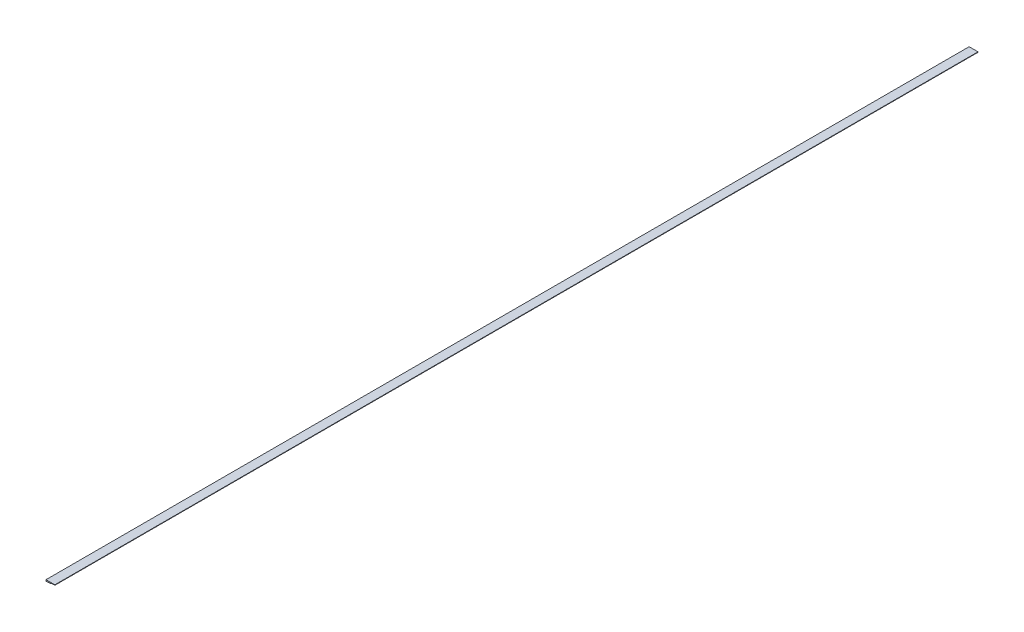
ISO-10303-21;
HEADER;
FILE_DESCRIPTION(('STEP AP214'),'2;1');
FILE_NAME('part.step','',(''),(''),'','','');
FILE_SCHEMA(('AUTOMOTIVE_DESIGN { 1 0 10303 214 1 1 1 1 }'));
ENDSEC;
DATA;
#1=APPLICATION_CONTEXT('core data for automotive mechanical design processes');
#2=APPLICATION_PROTOCOL_DEFINITION('international standard','automotive_design',2000,#1);
#3=PRODUCT_CONTEXT('',#1,'mechanical');
#4=PRODUCT('Part','Part','',(#3));
#5=PRODUCT_RELATED_PRODUCT_CATEGORY('part','',(#4));
#6=PRODUCT_DEFINITION_FORMATION('','',#4);
#7=PRODUCT_DEFINITION_CONTEXT('part definition',#1,'design');
#8=PRODUCT_DEFINITION('design','',#6,#7);
#9=PRODUCT_DEFINITION_SHAPE('','',#8);
#10=(LENGTH_UNIT() NAMED_UNIT(*) SI_UNIT(.MILLI.,.METRE.));
#11=(NAMED_UNIT(*) PLANE_ANGLE_UNIT() SI_UNIT($,.RADIAN.));
#12=(NAMED_UNIT(*) SI_UNIT($,.STERADIAN.) SOLID_ANGLE_UNIT());
#13=UNCERTAINTY_MEASURE_WITH_UNIT(LENGTH_MEASURE(1.E-05),#10,'distance_accuracy_value','');
#14=(GEOMETRIC_REPRESENTATION_CONTEXT(3) GLOBAL_UNCERTAINTY_ASSIGNED_CONTEXT((#13)) GLOBAL_UNIT_ASSIGNED_CONTEXT((#10,
#11,#12)) REPRESENTATION_CONTEXT('',''));
#15=CARTESIAN_POINT('',(0.,0.,0.));
#16=DIRECTION('',(0.,0.,1.));
#17=DIRECTION('',(1.,0.,0.));
#18=AXIS2_PLACEMENT_3D('',#15,#16,#17);
#19=CARTESIAN_POINT('',(-7.61942410709883,25.399999999932,-5265.01611975517));
#20=DIRECTION('',(0.,-1.,0.));
#21=DIRECTION('',(1.,0.,0.));
#22=AXIS2_PLACEMENT_3D('',#19,#20,#21);
#23=PLANE('',#22);
#24=DIRECTION('',(-1.,0.,0.));
#25=VECTOR('',#24,1.);
#26=CARTESIAN_POINT('',(-7.61942410709883,25.399999999932,-5214.4));
#27=LINE('',#26,#25);
#28=CARTESIAN_POINT('',(-4.44442410709883,25.399999999932,-5214.4));
#29=VERTEX_POINT('',#28);
#30=CARTESIAN_POINT('',(-7.61942410709883,25.399999999932,-5214.4));
#31=VERTEX_POINT('',#30);
#32=EDGE_CURVE('E43',#29,#31,#27,.T.);
#33=ORIENTED_EDGE('',*,*,#32,.F.);
#34=DIRECTION('',(0.,0.,1.));
#35=VECTOR('',#34,1.);
#36=CARTESIAN_POINT('',(-4.44442410709883,25.399999999932,-5265.01611975517));
#37=LINE('',#36,#35);
#38=CARTESIAN_POINT('',(-4.44442410709883,25.399999999932,0.));
#39=VERTEX_POINT('',#38);
#40=EDGE_CURVE('E88',#29,#39,#37,.T.);
#41=ORIENTED_EDGE('',*,*,#40,.T.);
#42=DIRECTION('',(1.,0.,0.));
#43=VECTOR('',#42,1.);
#44=CARTESIAN_POINT('',(-7.61942410709883,25.399999999932,0.));
#45=LINE('',#44,#43);
#46=CARTESIAN_POINT('',(-7.61942410709883,25.399999999932,0.));
#47=VERTEX_POINT('',#46);
#48=EDGE_CURVE('E92',#47,#39,#45,.T.);
#49=ORIENTED_EDGE('',*,*,#48,.F.);
#50=DIRECTION('',(0.,0.,1.));
#51=VECTOR('',#50,1.);
#52=CARTESIAN_POINT('',(-7.61942410709883,25.399999999932,-5265.01611975517));
#53=LINE('',#52,#51);
#54=EDGE_CURVE('E125',#31,#47,#53,.T.);
#55=ORIENTED_EDGE('',*,*,#54,.F.);
#56=EDGE_LOOP('',(#33,#41,#49,#55));
#57=FACE_BOUND('',#56,.T.);
#58=ADVANCED_FACE('F35',(#57),#23,.T.);
#59=CARTESIAN_POINT('',(-7.61942410709883,25.399999999932,-5265.01611975517));
#60=DIRECTION('',(0.0871557427456795,-0.996194698091919,0.));
#61=DIRECTION('',(0.996194698091919,0.0871557427456795,0.));
#62=AXIS2_PLACEMENT_3D('',#59,#60,#61);
#63=PLANE('',#62);
#64=DIRECTION('',(-0.996194698091919,-0.0871557427456795,0.));
#65=VECTOR('',#64,1.);
#66=CARTESIAN_POINT('',(-7.61942410709885,25.399999999932,-5214.4));
#67=LINE('',#66,#65);
#68=CARTESIAN_POINT('',(-32.6194241070988,23.2127834118339,-5214.4));
#69=VERTEX_POINT('',#68);
#70=EDGE_CURVE('E158',#31,#69,#67,.T.);
#71=ORIENTED_EDGE('',*,*,#70,.F.);
#72=ORIENTED_EDGE('',*,*,#54,.T.);
#73=DIRECTION('',(0.996194698091919,0.0871557427456795,0.));
#74=VECTOR('',#73,1.);
#75=CARTESIAN_POINT('',(-7.61942410709883,25.399999999932,0.));
#76=LINE('',#75,#74);
#77=CARTESIAN_POINT('',(-32.6194241070988,23.2127834118339,0.));
#78=VERTEX_POINT('',#77);
#79=EDGE_CURVE('E98',#78,#47,#76,.T.);
#80=ORIENTED_EDGE('',*,*,#79,.F.);
#81=DIRECTION('',(0.,0.,1.));
#82=VECTOR('',#81,1.);
#83=CARTESIAN_POINT('',(-32.6194241070988,23.2127834118339,-5265.01611975517));
#84=LINE('',#83,#82);
#85=EDGE_CURVE('E128',#69,#78,#84,.T.);
#86=ORIENTED_EDGE('',*,*,#85,.F.);
#87=EDGE_LOOP('',(#71,#72,#80,#86));
#88=FACE_BOUND('',#87,.T.);
#89=ADVANCED_FACE('F157',(#88),#63,.T.);
#90=CARTESIAN_POINT('',(-32.6194241070988,31.0862565380551,-5265.01611975517));
#91=DIRECTION('',(-1.,0.,0.));
#92=DIRECTION('',(0.,-1.,0.));
#93=AXIS2_PLACEMENT_3D('',#90,#91,#92);
#94=PLANE('',#93);
#95=DIRECTION('',(0.,1.,0.));
#96=VECTOR('',#95,1.);
#97=CARTESIAN_POINT('',(-32.6194241070988,31.0862565380549,-5214.4));
#98=LINE('',#97,#96);
#99=CARTESIAN_POINT('',(-32.6194241070989,31.0862565380551,-5214.4));
#100=VERTEX_POINT('',#99);
#101=EDGE_CURVE('E154',#69,#100,#98,.T.);
#102=ORIENTED_EDGE('',*,*,#101,.F.);
#103=ORIENTED_EDGE('',*,*,#85,.T.);
#104=DIRECTION('',(0.,-1.,0.));
#105=VECTOR('',#104,1.);
#106=CARTESIAN_POINT('',(-32.6194241070988,31.0862565380551,0.));
#107=LINE('',#106,#105);
#108=CARTESIAN_POINT('',(-32.6194241070988,31.0862565380551,0.));
#109=VERTEX_POINT('',#108);
#110=EDGE_CURVE('E122',#109,#78,#107,.T.);
#111=ORIENTED_EDGE('',*,*,#110,.F.);
#112=DIRECTION('',(0.,0.,1.));
#113=VECTOR('',#112,1.);
#114=CARTESIAN_POINT('',(-32.6194241070988,31.0862565380551,-5265.01611975517));
#115=LINE('',#114,#113);
#116=EDGE_CURVE('E130',#100,#109,#115,.T.);
#117=ORIENTED_EDGE('',*,*,#116,.F.);
#118=EDGE_LOOP('',(#102,#103,#111,#117));
#119=FACE_BOUND('',#118,.T.);
#120=ADVANCED_FACE('F152',(#119),#94,.T.);
#121=CARTESIAN_POINT('',(17.3805758929012,31.0862565380551,-5265.01611975517));
#122=DIRECTION('',(0.,1.,0.));
#123=DIRECTION('',(-1.,0.,0.));
#124=AXIS2_PLACEMENT_3D('',#121,#122,#123);
#125=PLANE('',#124);
#126=DIRECTION('',(1.,0.,0.));
#127=VECTOR('',#126,1.);
#128=CARTESIAN_POINT('',(17.3805758929012,31.0862565380551,-5214.4));
#129=LINE('',#128,#127);
#130=CARTESIAN_POINT('',(17.3805758929012,31.0862565380551,-5214.4));
#131=VERTEX_POINT('',#130);
#132=EDGE_CURVE('E149',#100,#131,#129,.T.);
#133=ORIENTED_EDGE('',*,*,#132,.F.);
#134=ORIENTED_EDGE('',*,*,#116,.T.);
#135=DIRECTION('',(-1.,0.,0.));
#136=VECTOR('',#135,1.);
#137=CARTESIAN_POINT('',(17.3805758929012,31.0862565380551,0.));
#138=LINE('',#137,#136);
#139=CARTESIAN_POINT('',(17.3805758929012,31.0862565380551,0.));
#140=VERTEX_POINT('',#139);
#141=EDGE_CURVE('E119',#140,#109,#138,.T.);
#142=ORIENTED_EDGE('',*,*,#141,.F.);
#143=DIRECTION('',(0.,0.,1.));
#144=VECTOR('',#143,1.);
#145=CARTESIAN_POINT('',(17.3805758929012,31.0862565380551,-5265.01611975517));
#146=LINE('',#145,#144);
#147=EDGE_CURVE('E132',#131,#140,#146,.T.);
#148=ORIENTED_EDGE('',*,*,#147,.F.);
#149=EDGE_LOOP('',(#133,#134,#142,#148));
#150=FACE_BOUND('',#149,.T.);
#151=ADVANCED_FACE('F147',(#150),#125,.T.);
#152=CARTESIAN_POINT('',(17.3805758929012,28.574999999932,-5265.01611975517));
#153=DIRECTION('',(1.,0.,0.));
#154=DIRECTION('',(0.,0.,-1.));
#155=AXIS2_PLACEMENT_3D('',#152,#153,#154);
#156=PLANE('',#155);
#157=DIRECTION('',(0.,-1.,0.));
#158=VECTOR('',#157,1.);
#159=CARTESIAN_POINT('',(17.3805758929012,28.5749999999318,-5214.4));
#160=LINE('',#159,#158);
#161=CARTESIAN_POINT('',(17.3805758929012,28.574999999932,-5214.4));
#162=VERTEX_POINT('',#161);
#163=EDGE_CURVE('E50',#131,#162,#160,.T.);
#164=ORIENTED_EDGE('',*,*,#163,.F.);
#165=ORIENTED_EDGE('',*,*,#147,.T.);
#166=DIRECTION('',(0.,1.,0.));
#167=VECTOR('',#166,1.);
#168=CARTESIAN_POINT('',(17.3805758929012,28.574999999932,0.));
#169=LINE('',#168,#167);
#170=CARTESIAN_POINT('',(17.3805758929012,28.574999999932,0.));
#171=VERTEX_POINT('',#170);
#172=EDGE_CURVE('E116',#171,#140,#169,.T.);
#173=ORIENTED_EDGE('',*,*,#172,.F.);
#174=DIRECTION('',(0.,0.,1.));
#175=VECTOR('',#174,1.);
#176=CARTESIAN_POINT('',(17.3805758929012,28.574999999932,-5265.01611975517));
#177=LINE('',#176,#175);
#178=EDGE_CURVE('E134',#162,#171,#177,.T.);
#179=ORIENTED_EDGE('',*,*,#178,.F.);
#180=EDGE_LOOP('',(#164,#165,#173,#179));
#181=FACE_BOUND('',#180,.T.);
#182=ADVANCED_FACE('F141',(#181),#156,.T.);
#183=CARTESIAN_POINT('',(-4.44442410709883,28.574999999932,-5265.01611975517));
#184=DIRECTION('',(0.,-1.,0.));
#185=DIRECTION('',(0.,0.,-1.));
#186=AXIS2_PLACEMENT_3D('',#183,#184,#185);
#187=PLANE('',#186);
#188=DIRECTION('',(-1.,0.,0.));
#189=VECTOR('',#188,1.);
#190=CARTESIAN_POINT('',(-4.44442410709883,28.574999999932,-5214.4));
#191=LINE('',#190,#189);
#192=CARTESIAN_POINT('',(-4.44442410709883,28.574999999932,-5214.4));
#193=VERTEX_POINT('',#192);
#194=EDGE_CURVE('E127',#162,#193,#191,.T.);
#195=ORIENTED_EDGE('',*,*,#194,.F.);
#196=ORIENTED_EDGE('',*,*,#178,.T.);
#197=DIRECTION('',(1.,0.,0.));
#198=VECTOR('',#197,1.);
#199=CARTESIAN_POINT('',(-4.44442410709883,28.574999999932,0.));
#200=LINE('',#199,#198);
#201=CARTESIAN_POINT('',(-4.44442410709883,28.574999999932,0.));
#202=VERTEX_POINT('',#201);
#203=EDGE_CURVE('E106',#202,#171,#200,.T.);
#204=ORIENTED_EDGE('',*,*,#203,.F.);
#205=DIRECTION('',(0.,0.,1.));
#206=VECTOR('',#205,1.);
#207=CARTESIAN_POINT('',(-4.44442410709883,28.574999999932,-5265.01611975517));
#208=LINE('',#207,#206);
#209=EDGE_CURVE('E97',#193,#202,#208,.T.);
#210=ORIENTED_EDGE('',*,*,#209,.F.);
#211=EDGE_LOOP('',(#195,#196,#204,#210));
#212=FACE_BOUND('',#211,.T.);
#213=ADVANCED_FACE('F139',(#212),#187,.T.);
#214=CARTESIAN_POINT('',(-4.44442410709883,25.399999999932,-5265.01611975517));
#215=DIRECTION('',(1.,0.,0.));
#216=DIRECTION('',(0.,0.,-1.));
#217=AXIS2_PLACEMENT_3D('',#214,#215,#216);
#218=PLANE('',#217);
#219=DIRECTION('',(0.,-1.,0.));
#220=VECTOR('',#219,1.);
#221=CARTESIAN_POINT('',(-4.44442410709883,25.3999999999318,-5214.4));
#222=LINE('',#221,#220);
#223=EDGE_CURVE('E11',#193,#29,#222,.T.);
#224=ORIENTED_EDGE('',*,*,#223,.F.);
#225=ORIENTED_EDGE('',*,*,#209,.T.);
#226=DIRECTION('',(0.,1.,0.));
#227=VECTOR('',#226,1.);
#228=CARTESIAN_POINT('',(-4.44442410709883,25.399999999932,0.));
#229=LINE('',#228,#227);
#230=EDGE_CURVE('E100',#39,#202,#229,.T.);
#231=ORIENTED_EDGE('',*,*,#230,.F.);
#232=ORIENTED_EDGE('',*,*,#40,.F.);
#233=EDGE_LOOP('',(#224,#225,#231,#232));
#234=FACE_BOUND('',#233,.T.);
#235=ADVANCED_FACE('F101',(#234),#218,.T.);
#236=CARTESIAN_POINT('',(0.,0.,0.));
#237=DIRECTION('',(0.,0.,1.));
#238=DIRECTION('',(1.,0.,0.));
#239=AXIS2_PLACEMENT_3D('',#236,#237,#238);
#240=PLANE('',#239);
#241=ORIENTED_EDGE('',*,*,#48,.T.);
#242=ORIENTED_EDGE('',*,*,#230,.T.);
#243=ORIENTED_EDGE('',*,*,#203,.T.);
#244=ORIENTED_EDGE('',*,*,#172,.T.);
#245=ORIENTED_EDGE('',*,*,#141,.T.);
#246=ORIENTED_EDGE('',*,*,#110,.T.);
#247=ORIENTED_EDGE('',*,*,#79,.T.);
#248=EDGE_LOOP('',(#241,#242,#243,#244,#245,#246,#247));
#249=FACE_BOUND('',#248,.T.);
#250=ADVANCED_FACE('F108',(#249),#240,.T.);
#251=CARTESIAN_POINT('',(-2103.00317746448,-160.701499757394,-5214.4));
#252=DIRECTION('',(0.,0.,1.));
#253=DIRECTION('',(-0.0871557427476582,0.996194698091746,0.));
#254=AXIS2_PLACEMENT_3D('',#251,#252,#253);
#255=PLANE('',#254);
#256=ORIENTED_EDGE('',*,*,#32,.T.);
#257=ORIENTED_EDGE('',*,*,#70,.T.);
#258=ORIENTED_EDGE('',*,*,#101,.T.);
#259=ORIENTED_EDGE('',*,*,#132,.T.);
#260=ORIENTED_EDGE('',*,*,#163,.T.);
#261=ORIENTED_EDGE('',*,*,#194,.T.);
#262=ORIENTED_EDGE('',*,*,#223,.T.);
#263=EDGE_LOOP('',(#256,#257,#258,#259,#260,#261,#262));
#264=FACE_BOUND('',#263,.T.);
#265=ADVANCED_FACE('F159',(#264),#255,.F.);
#266=CLOSED_SHELL('',(#58,#89,#120,#151,#182,#213,#235,#250,#265));
#267=MANIFOLD_SOLID_BREP('B2',#266);
#268=ADVANCED_BREP_SHAPE_REPRESENTATION('',(#18,#267),#14);
#269=SHAPE_DEFINITION_REPRESENTATION(#9,#268);
ENDSEC;
END-ISO-10303-21;
